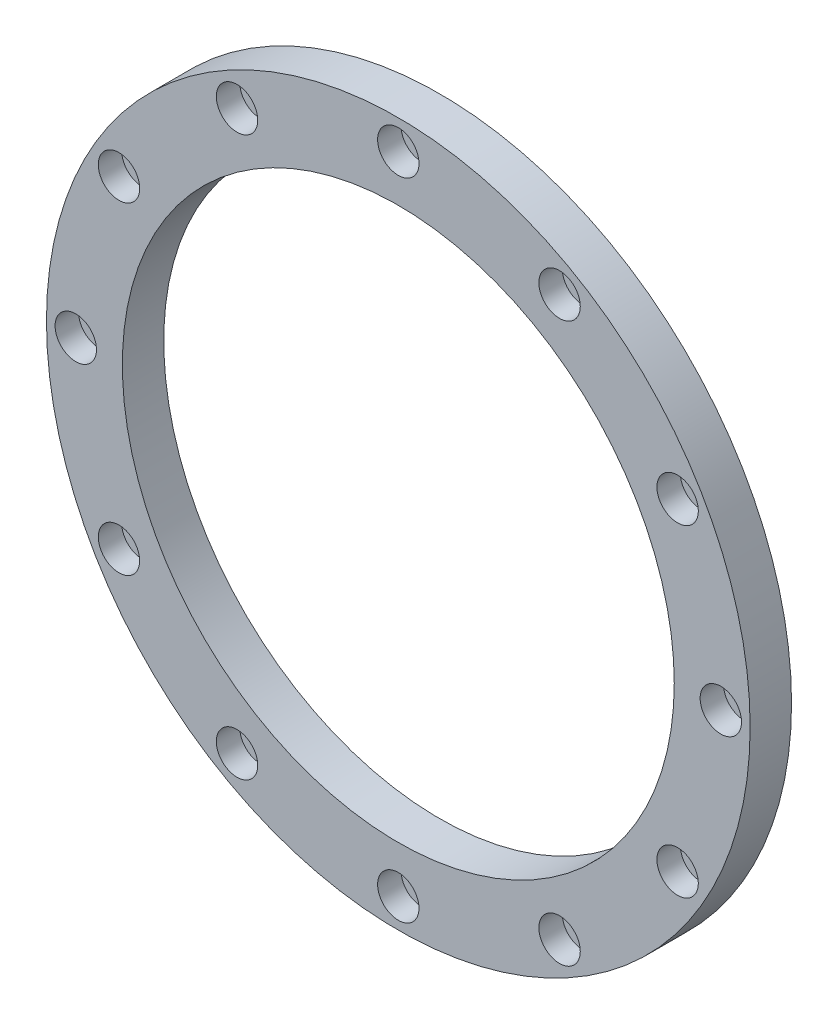
ISO-10303-21;
HEADER;
FILE_DESCRIPTION(('STEP AP214'),'2;1');
FILE_NAME('part.step','',(''),(''),'','','');
FILE_SCHEMA(('AUTOMOTIVE_DESIGN { 1 0 10303 214 1 1 1 1 }'));
ENDSEC;
DATA;
#1=APPLICATION_CONTEXT('core data for automotive mechanical design processes');
#2=APPLICATION_PROTOCOL_DEFINITION('international standard','automotive_design',2000,#1);
#3=PRODUCT_CONTEXT('',#1,'mechanical');
#4=PRODUCT('Part','Part','',(#3));
#5=PRODUCT_RELATED_PRODUCT_CATEGORY('part','',(#4));
#6=PRODUCT_DEFINITION_FORMATION('','',#4);
#7=PRODUCT_DEFINITION_CONTEXT('part definition',#1,'design');
#8=PRODUCT_DEFINITION('design','',#6,#7);
#9=PRODUCT_DEFINITION_SHAPE('','',#8);
#10=(LENGTH_UNIT() NAMED_UNIT(*) SI_UNIT(.MILLI.,.METRE.));
#11=(NAMED_UNIT(*) PLANE_ANGLE_UNIT() SI_UNIT($,.RADIAN.));
#12=(NAMED_UNIT(*) SI_UNIT($,.STERADIAN.) SOLID_ANGLE_UNIT());
#13=UNCERTAINTY_MEASURE_WITH_UNIT(LENGTH_MEASURE(1.E-05),#10,'distance_accuracy_value','');
#14=(GEOMETRIC_REPRESENTATION_CONTEXT(3) GLOBAL_UNCERTAINTY_ASSIGNED_CONTEXT((#13)) GLOBAL_UNIT_ASSIGNED_CONTEXT((#10,
#11,#12)) REPRESENTATION_CONTEXT('',''));
#15=CARTESIAN_POINT('',(0.,0.,0.));
#16=DIRECTION('',(0.,0.,1.));
#17=DIRECTION('',(1.,0.,0.));
#18=AXIS2_PLACEMENT_3D('',#15,#16,#17);
#19=CARTESIAN_POINT('',(0.,0.,6.));
#20=DIRECTION('',(0.,0.,-1.));
#21=DIRECTION('',(-1.,0.,0.));
#22=AXIS2_PLACEMENT_3D('',#19,#20,#21);
#23=CYLINDRICAL_SURFACE('',#22,51.);
#24=CARTESIAN_POINT('',(0.,0.,6.));
#25=DIRECTION('',(0.,0.,1.));
#26=DIRECTION('',(1.,0.,0.));
#27=AXIS2_PLACEMENT_3D('',#24,#25,#26);
#28=CIRCLE('',#27,51.);
#29=CARTESIAN_POINT('',(51.,0.,6.));
#30=VERTEX_POINT('',#29);
#31=EDGE_CURVE('E10',#30,#30,#28,.T.);
#32=ORIENTED_EDGE('',*,*,#31,.F.);
#33=EDGE_LOOP('',(#32));
#34=FACE_BOUND('',#33,.T.);
#35=CARTESIAN_POINT('',(0.,0.,0.));
#36=DIRECTION('',(0.,0.,1.));
#37=DIRECTION('',(1.,0.,0.));
#38=AXIS2_PLACEMENT_3D('',#35,#36,#37);
#39=CIRCLE('',#38,51.);
#40=CARTESIAN_POINT('',(51.,0.,0.));
#41=VERTEX_POINT('',#40);
#42=EDGE_CURVE('E36',#41,#41,#39,.T.);
#43=ORIENTED_EDGE('',*,*,#42,.T.);
#44=EDGE_LOOP('',(#43));
#45=FACE_BOUND('',#44,.T.);
#46=ADVANCED_FACE('F33',(#34,#45),#23,.T.);
#47=CARTESIAN_POINT('',(0.,0.,6.));
#48=DIRECTION('',(0.,0.,1.));
#49=DIRECTION('',(1.,0.,0.));
#50=AXIS2_PLACEMENT_3D('',#47,#48,#49);
#51=PLANE('',#50);
#52=CARTESIAN_POINT('',(23.3749999999995,40.4866876269228,6.));
#53=DIRECTION('',(0.,0.,1.));
#54=DIRECTION('',(1.,0.,0.));
#55=AXIS2_PLACEMENT_3D('',#52,#53,#54);
#56=CIRCLE('',#55,3.);
#57=CARTESIAN_POINT('',(26.3749999999995,40.4866876269228,6.));
#58=VERTEX_POINT('',#57);
#59=EDGE_CURVE('E191',#58,#58,#56,.T.);
#60=ORIENTED_EDGE('',*,*,#59,.F.);
#61=EDGE_LOOP('',(#60));
#62=FACE_BOUND('',#61,.T.);
#63=CARTESIAN_POINT('',(40.4866876269222,23.3750000000005,6.));
#64=DIRECTION('',(0.,0.,1.));
#65=DIRECTION('',(1.,0.,0.));
#66=AXIS2_PLACEMENT_3D('',#63,#64,#65);
#67=CIRCLE('',#66,3.);
#68=CARTESIAN_POINT('',(43.4866876269222,23.3750000000005,6.));
#69=VERTEX_POINT('',#68);
#70=EDGE_CURVE('E179',#69,#69,#67,.T.);
#71=ORIENTED_EDGE('',*,*,#70,.F.);
#72=EDGE_LOOP('',(#71));
#73=FACE_BOUND('',#72,.T.);
#74=CARTESIAN_POINT('',(46.75,4.89680257772749E-13,6.));
#75=DIRECTION('',(0.,0.,1.));
#76=DIRECTION('',(1.,0.,0.));
#77=AXIS2_PLACEMENT_3D('',#74,#75,#76);
#78=CIRCLE('',#77,3.);
#79=CARTESIAN_POINT('',(49.75,4.89680257772749E-13,6.));
#80=VERTEX_POINT('',#79);
#81=EDGE_CURVE('E167',#80,#80,#78,.T.);
#82=ORIENTED_EDGE('',*,*,#81,.F.);
#83=EDGE_LOOP('',(#82));
#84=FACE_BOUND('',#83,.T.);
#85=CARTESIAN_POINT('',(40.4866876269227,-23.3749999999996,6.));
#86=DIRECTION('',(0.,0.,1.));
#87=DIRECTION('',(1.,0.,0.));
#88=AXIS2_PLACEMENT_3D('',#85,#86,#87);
#89=CIRCLE('',#88,3.);
#90=CARTESIAN_POINT('',(43.4866876269227,-23.3749999999996,6.));
#91=VERTEX_POINT('',#90);
#92=EDGE_CURVE('E155',#91,#91,#89,.T.);
#93=ORIENTED_EDGE('',*,*,#92,.F.);
#94=EDGE_LOOP('',(#93));
#95=FACE_BOUND('',#94,.T.);
#96=CARTESIAN_POINT('',(23.3750000000003,-40.4866876269223,6.));
#97=DIRECTION('',(0.,0.,1.));
#98=DIRECTION('',(1.,0.,0.));
#99=AXIS2_PLACEMENT_3D('',#96,#97,#98);
#100=CIRCLE('',#99,3.);
#101=CARTESIAN_POINT('',(26.3750000000003,-40.4866876269223,6.));
#102=VERTEX_POINT('',#101);
#103=EDGE_CURVE('E143',#102,#102,#100,.T.);
#104=ORIENTED_EDGE('',*,*,#103,.F.);
#105=EDGE_LOOP('',(#104));
#106=FACE_BOUND('',#105,.T.);
#107=CARTESIAN_POINT('',(0.,-46.75,6.));
#108=DIRECTION('',(0.,0.,1.));
#109=DIRECTION('',(1.,0.,0.));
#110=AXIS2_PLACEMENT_3D('',#107,#108,#109);
#111=CIRCLE('',#110,3.);
#112=CARTESIAN_POINT('',(3.,-46.75,6.));
#113=VERTEX_POINT('',#112);
#114=EDGE_CURVE('E131',#113,#113,#111,.T.);
#115=ORIENTED_EDGE('',*,*,#114,.F.);
#116=EDGE_LOOP('',(#115));
#117=FACE_BOUND('',#116,.T.);
#118=CARTESIAN_POINT('',(-23.3749999999998,-40.4866876269226,6.));
#119=DIRECTION('',(0.,0.,1.));
#120=DIRECTION('',(1.,0.,0.));
#121=AXIS2_PLACEMENT_3D('',#118,#119,#120);
#122=CIRCLE('',#121,3.);
#123=CARTESIAN_POINT('',(-20.3749999999998,-40.4866876269226,6.));
#124=VERTEX_POINT('',#123);
#125=EDGE_CURVE('E119',#124,#124,#122,.T.);
#126=ORIENTED_EDGE('',*,*,#125,.F.);
#127=EDGE_LOOP('',(#126));
#128=FACE_BOUND('',#127,.T.);
#129=CARTESIAN_POINT('',(-40.4866876269224,-23.3750000000002,6.));
#130=DIRECTION('',(0.,0.,1.));
#131=DIRECTION('',(1.,0.,0.));
#132=AXIS2_PLACEMENT_3D('',#129,#130,#131);
#133=CIRCLE('',#132,3.);
#134=CARTESIAN_POINT('',(-37.4866876269224,-23.3750000000002,6.));
#135=VERTEX_POINT('',#134);
#136=EDGE_CURVE('E107',#135,#135,#133,.T.);
#137=ORIENTED_EDGE('',*,*,#136,.F.);
#138=EDGE_LOOP('',(#137));
#139=FACE_BOUND('',#138,.T.);
#140=CARTESIAN_POINT('',(-46.75,-1.63226752590916E-13,6.));
#141=DIRECTION('',(0.,0.,1.));
#142=DIRECTION('',(1.,0.,0.));
#143=AXIS2_PLACEMENT_3D('',#140,#141,#142);
#144=CIRCLE('',#143,3.);
#145=CARTESIAN_POINT('',(-43.75,-1.63226752590916E-13,6.));
#146=VERTEX_POINT('',#145);
#147=EDGE_CURVE('E95',#146,#146,#144,.T.);
#148=ORIENTED_EDGE('',*,*,#147,.F.);
#149=EDGE_LOOP('',(#148));
#150=FACE_BOUND('',#149,.T.);
#151=CARTESIAN_POINT('',(-40.4866876269226,23.3749999999999,6.));
#152=DIRECTION('',(0.,0.,1.));
#153=DIRECTION('',(1.,0.,0.));
#154=AXIS2_PLACEMENT_3D('',#151,#152,#153);
#155=CIRCLE('',#154,3.);
#156=CARTESIAN_POINT('',(-37.4866876269226,23.3749999999999,6.));
#157=VERTEX_POINT('',#156);
#158=EDGE_CURVE('E83',#157,#157,#155,.T.);
#159=ORIENTED_EDGE('',*,*,#158,.F.);
#160=EDGE_LOOP('',(#159));
#161=FACE_BOUND('',#160,.T.);
#162=CARTESIAN_POINT('',(-23.375,40.4866876269225,6.));
#163=DIRECTION('',(0.,0.,1.));
#164=DIRECTION('',(1.,0.,0.));
#165=AXIS2_PLACEMENT_3D('',#162,#163,#164);
#166=CIRCLE('',#165,3.);
#167=CARTESIAN_POINT('',(-20.375,40.4866876269225,6.));
#168=VERTEX_POINT('',#167);
#169=EDGE_CURVE('E71',#168,#168,#166,.T.);
#170=ORIENTED_EDGE('',*,*,#169,.F.);
#171=EDGE_LOOP('',(#170));
#172=FACE_BOUND('',#171,.T.);
#173=CARTESIAN_POINT('',(0.,0.,6.));
#174=DIRECTION('',(0.,0.,1.));
#175=DIRECTION('',(1.,0.,0.));
#176=AXIS2_PLACEMENT_3D('',#173,#174,#175);
#177=CIRCLE('',#176,40.);
#178=CARTESIAN_POINT('',(40.,0.,6.));
#179=VERTEX_POINT('',#178);
#180=EDGE_CURVE('E57',#179,#179,#177,.T.);
#181=ORIENTED_EDGE('',*,*,#180,.F.);
#182=EDGE_LOOP('',(#181));
#183=FACE_BOUND('',#182,.T.);
#184=CARTESIAN_POINT('',(0.,46.75,6.));
#185=DIRECTION('',(0.,0.,1.));
#186=DIRECTION('',(1.,0.,0.));
#187=AXIS2_PLACEMENT_3D('',#184,#185,#186);
#188=CIRCLE('',#187,3.);
#189=CARTESIAN_POINT('',(3.,46.75,6.));
#190=VERTEX_POINT('',#189);
#191=EDGE_CURVE('E53',#190,#190,#188,.T.);
#192=ORIENTED_EDGE('',*,*,#191,.F.);
#193=EDGE_LOOP('',(#192));
#194=FACE_BOUND('',#193,.T.);
#195=ORIENTED_EDGE('',*,*,#31,.T.);
#196=EDGE_LOOP('',(#195));
#197=FACE_BOUND('',#196,.T.);
#198=ADVANCED_FACE('F197',(#62,#73,#84,#95,#106,#117,#128,#139,#150,#161,#172,#183,#194,#197),
#51,.T.);
#199=CARTESIAN_POINT('',(0.,0.,0.));
#200=DIRECTION('',(0.,0.,1.));
#201=DIRECTION('',(1.,0.,0.));
#202=AXIS2_PLACEMENT_3D('',#199,#200,#201);
#203=PLANE('',#202);
#204=CARTESIAN_POINT('',(23.3749999999995,40.4866876269228,0.));
#205=DIRECTION('',(0.,0.,1.));
#206=DIRECTION('',(1.,0.,0.));
#207=AXIS2_PLACEMENT_3D('',#204,#205,#206);
#208=CIRCLE('',#207,1.7);
#209=CARTESIAN_POINT('',(25.0749999999995,40.4866876269228,0.));
#210=VERTEX_POINT('',#209);
#211=EDGE_CURVE('E182',#210,#210,#208,.T.);
#212=ORIENTED_EDGE('',*,*,#211,.T.);
#213=EDGE_LOOP('',(#212));
#214=FACE_BOUND('',#213,.T.);
#215=CARTESIAN_POINT('',(40.4866876269222,23.3750000000005,0.));
#216=DIRECTION('',(0.,0.,1.));
#217=DIRECTION('',(1.,0.,0.));
#218=AXIS2_PLACEMENT_3D('',#215,#216,#217);
#219=CIRCLE('',#218,1.7);
#220=CARTESIAN_POINT('',(42.1866876269222,23.3750000000005,0.));
#221=VERTEX_POINT('',#220);
#222=EDGE_CURVE('E170',#221,#221,#219,.T.);
#223=ORIENTED_EDGE('',*,*,#222,.T.);
#224=EDGE_LOOP('',(#223));
#225=FACE_BOUND('',#224,.T.);
#226=CARTESIAN_POINT('',(46.75,4.89680257772749E-13,0.));
#227=DIRECTION('',(0.,0.,1.));
#228=DIRECTION('',(1.,0.,0.));
#229=AXIS2_PLACEMENT_3D('',#226,#227,#228);
#230=CIRCLE('',#229,1.7);
#231=CARTESIAN_POINT('',(48.45,4.89680257772749E-13,0.));
#232=VERTEX_POINT('',#231);
#233=EDGE_CURVE('E158',#232,#232,#230,.T.);
#234=ORIENTED_EDGE('',*,*,#233,.T.);
#235=EDGE_LOOP('',(#234));
#236=FACE_BOUND('',#235,.T.);
#237=CARTESIAN_POINT('',(40.4866876269227,-23.3749999999996,0.));
#238=DIRECTION('',(0.,0.,1.));
#239=DIRECTION('',(1.,0.,0.));
#240=AXIS2_PLACEMENT_3D('',#237,#238,#239);
#241=CIRCLE('',#240,1.7);
#242=CARTESIAN_POINT('',(42.1866876269227,-23.3749999999996,0.));
#243=VERTEX_POINT('',#242);
#244=EDGE_CURVE('E146',#243,#243,#241,.T.);
#245=ORIENTED_EDGE('',*,*,#244,.T.);
#246=EDGE_LOOP('',(#245));
#247=FACE_BOUND('',#246,.T.);
#248=CARTESIAN_POINT('',(23.3750000000003,-40.4866876269223,0.));
#249=DIRECTION('',(0.,0.,1.));
#250=DIRECTION('',(1.,0.,0.));
#251=AXIS2_PLACEMENT_3D('',#248,#249,#250);
#252=CIRCLE('',#251,1.7);
#253=CARTESIAN_POINT('',(25.0750000000003,-40.4866876269223,0.));
#254=VERTEX_POINT('',#253);
#255=EDGE_CURVE('E134',#254,#254,#252,.T.);
#256=ORIENTED_EDGE('',*,*,#255,.T.);
#257=EDGE_LOOP('',(#256));
#258=FACE_BOUND('',#257,.T.);
#259=CARTESIAN_POINT('',(0.,-46.75,0.));
#260=DIRECTION('',(0.,0.,1.));
#261=DIRECTION('',(1.,0.,0.));
#262=AXIS2_PLACEMENT_3D('',#259,#260,#261);
#263=CIRCLE('',#262,1.7);
#264=CARTESIAN_POINT('',(1.7,-46.75,0.));
#265=VERTEX_POINT('',#264);
#266=EDGE_CURVE('E122',#265,#265,#263,.T.);
#267=ORIENTED_EDGE('',*,*,#266,.T.);
#268=EDGE_LOOP('',(#267));
#269=FACE_BOUND('',#268,.T.);
#270=CARTESIAN_POINT('',(-23.3749999999998,-40.4866876269226,0.));
#271=DIRECTION('',(0.,0.,1.));
#272=DIRECTION('',(1.,0.,0.));
#273=AXIS2_PLACEMENT_3D('',#270,#271,#272);
#274=CIRCLE('',#273,1.7);
#275=CARTESIAN_POINT('',(-21.6749999999998,-40.4866876269226,0.));
#276=VERTEX_POINT('',#275);
#277=EDGE_CURVE('E110',#276,#276,#274,.T.);
#278=ORIENTED_EDGE('',*,*,#277,.T.);
#279=EDGE_LOOP('',(#278));
#280=FACE_BOUND('',#279,.T.);
#281=CARTESIAN_POINT('',(-40.4866876269224,-23.3750000000002,0.));
#282=DIRECTION('',(0.,0.,1.));
#283=DIRECTION('',(1.,0.,0.));
#284=AXIS2_PLACEMENT_3D('',#281,#282,#283);
#285=CIRCLE('',#284,1.7);
#286=CARTESIAN_POINT('',(-38.7866876269224,-23.3750000000002,0.));
#287=VERTEX_POINT('',#286);
#288=EDGE_CURVE('E98',#287,#287,#285,.T.);
#289=ORIENTED_EDGE('',*,*,#288,.T.);
#290=EDGE_LOOP('',(#289));
#291=FACE_BOUND('',#290,.T.);
#292=CARTESIAN_POINT('',(-46.75,-1.63226752590916E-13,0.));
#293=DIRECTION('',(0.,0.,1.));
#294=DIRECTION('',(1.,0.,0.));
#295=AXIS2_PLACEMENT_3D('',#292,#293,#294);
#296=CIRCLE('',#295,1.7);
#297=CARTESIAN_POINT('',(-45.05,-1.63226752590916E-13,0.));
#298=VERTEX_POINT('',#297);
#299=EDGE_CURVE('E86',#298,#298,#296,.T.);
#300=ORIENTED_EDGE('',*,*,#299,.T.);
#301=EDGE_LOOP('',(#300));
#302=FACE_BOUND('',#301,.T.);
#303=CARTESIAN_POINT('',(-40.4866876269226,23.3749999999999,0.));
#304=DIRECTION('',(0.,0.,1.));
#305=DIRECTION('',(1.,0.,0.));
#306=AXIS2_PLACEMENT_3D('',#303,#304,#305);
#307=CIRCLE('',#306,1.7);
#308=CARTESIAN_POINT('',(-38.7866876269226,23.3749999999999,0.));
#309=VERTEX_POINT('',#308);
#310=EDGE_CURVE('E74',#309,#309,#307,.T.);
#311=ORIENTED_EDGE('',*,*,#310,.T.);
#312=EDGE_LOOP('',(#311));
#313=FACE_BOUND('',#312,.T.);
#314=CARTESIAN_POINT('',(-23.375,40.4866876269225,0.));
#315=DIRECTION('',(0.,0.,1.));
#316=DIRECTION('',(1.,0.,0.));
#317=AXIS2_PLACEMENT_3D('',#314,#315,#316);
#318=CIRCLE('',#317,1.7);
#319=CARTESIAN_POINT('',(-21.675,40.4866876269225,0.));
#320=VERTEX_POINT('',#319);
#321=EDGE_CURVE('E60',#320,#320,#318,.T.);
#322=ORIENTED_EDGE('',*,*,#321,.T.);
#323=EDGE_LOOP('',(#322));
#324=FACE_BOUND('',#323,.T.);
#325=CARTESIAN_POINT('',(0.,0.,0.));
#326=DIRECTION('',(0.,0.,1.));
#327=DIRECTION('',(1.,0.,0.));
#328=AXIS2_PLACEMENT_3D('',#325,#326,#327);
#329=CIRCLE('',#328,40.);
#330=CARTESIAN_POINT('',(40.,0.,0.));
#331=VERTEX_POINT('',#330);
#332=EDGE_CURVE('E56',#331,#331,#329,.T.);
#333=ORIENTED_EDGE('',*,*,#332,.T.);
#334=EDGE_LOOP('',(#333));
#335=FACE_BOUND('',#334,.T.);
#336=CARTESIAN_POINT('',(0.,46.75,0.));
#337=DIRECTION('',(0.,0.,1.));
#338=DIRECTION('',(1.,0.,0.));
#339=AXIS2_PLACEMENT_3D('',#336,#337,#338);
#340=CIRCLE('',#339,1.7);
#341=CARTESIAN_POINT('',(1.7,46.75,0.));
#342=VERTEX_POINT('',#341);
#343=EDGE_CURVE('E43',#342,#342,#340,.T.);
#344=ORIENTED_EDGE('',*,*,#343,.T.);
#345=EDGE_LOOP('',(#344));
#346=FACE_BOUND('',#345,.T.);
#347=ORIENTED_EDGE('',*,*,#42,.F.);
#348=EDGE_LOOP('',(#347));
#349=FACE_BOUND('',#348,.T.);
#350=ADVANCED_FACE('F200',(#214,#225,#236,#247,#258,#269,#280,#291,#302,#313,#324,#335,#346,
#349),#203,.F.);
#351=CARTESIAN_POINT('',(0.,46.75,6.));
#352=DIRECTION('',(0.,0.,1.));
#353=DIRECTION('',(1.,0.,0.));
#354=AXIS2_PLACEMENT_3D('',#351,#352,#353);
#355=CYLINDRICAL_SURFACE('',#354,1.7);
#356=ORIENTED_EDGE('',*,*,#343,.F.);
#357=EDGE_LOOP('',(#356));
#358=FACE_BOUND('',#357,.T.);
#359=CARTESIAN_POINT('',(0.,46.75,2.6));
#360=DIRECTION('',(0.,0.,1.));
#361=DIRECTION('',(1.,0.,0.));
#362=AXIS2_PLACEMENT_3D('',#359,#360,#361);
#363=CIRCLE('',#362,1.7);
#364=CARTESIAN_POINT('',(1.7,46.75,2.6));
#365=VERTEX_POINT('',#364);
#366=EDGE_CURVE('E47',#365,#365,#363,.T.);
#367=ORIENTED_EDGE('',*,*,#366,.T.);
#368=EDGE_LOOP('',(#367));
#369=FACE_BOUND('',#368,.T.);
#370=ADVANCED_FACE('F239',(#358,#369),#355,.F.);
#371=CARTESIAN_POINT('',(1.7,46.75,2.6));
#372=DIRECTION('',(0.,0.,-1.));
#373=DIRECTION('',(-1.,0.,0.));
#374=AXIS2_PLACEMENT_3D('',#371,#372,#373);
#375=PLANE('',#374);
#376=ORIENTED_EDGE('',*,*,#366,.F.);
#377=EDGE_LOOP('',(#376));
#378=FACE_BOUND('',#377,.T.);
#379=CARTESIAN_POINT('',(0.,46.75,2.6));
#380=DIRECTION('',(0.,0.,1.));
#381=DIRECTION('',(1.,0.,0.));
#382=AXIS2_PLACEMENT_3D('',#379,#380,#381);
#383=CIRCLE('',#382,3.);
#384=CARTESIAN_POINT('',(3.,46.75,2.6));
#385=VERTEX_POINT('',#384);
#386=EDGE_CURVE('E50',#385,#385,#383,.T.);
#387=ORIENTED_EDGE('',*,*,#386,.T.);
#388=EDGE_LOOP('',(#387));
#389=FACE_BOUND('',#388,.T.);
#390=ADVANCED_FACE('F229',(#378,#389),#375,.F.);
#391=CARTESIAN_POINT('',(0.,46.75,6.));
#392=DIRECTION('',(0.,0.,1.));
#393=DIRECTION('',(1.,0.,0.));
#394=AXIS2_PLACEMENT_3D('',#391,#392,#393);
#395=CYLINDRICAL_SURFACE('',#394,3.);
#396=ORIENTED_EDGE('',*,*,#386,.F.);
#397=EDGE_LOOP('',(#396));
#398=FACE_BOUND('',#397,.T.);
#399=ORIENTED_EDGE('',*,*,#191,.T.);
#400=EDGE_LOOP('',(#399));
#401=FACE_BOUND('',#400,.T.);
#402=ADVANCED_FACE('F226',(#398,#401),#395,.F.);
#403=CARTESIAN_POINT('',(0.,0.,0.));
#404=DIRECTION('',(0.,0.,1.));
#405=DIRECTION('',(1.,0.,0.));
#406=AXIS2_PLACEMENT_3D('',#403,#404,#405);
#407=CYLINDRICAL_SURFACE('',#406,40.);
#408=ORIENTED_EDGE('',*,*,#332,.F.);
#409=EDGE_LOOP('',(#408));
#410=FACE_BOUND('',#409,.T.);
#411=ORIENTED_EDGE('',*,*,#180,.T.);
#412=EDGE_LOOP('',(#411));
#413=FACE_BOUND('',#412,.T.);
#414=ADVANCED_FACE('F228',(#410,#413),#407,.F.);
#415=CARTESIAN_POINT('',(-23.375,40.4866876269225,6.));
#416=DIRECTION('',(0.,0.,1.));
#417=DIRECTION('',(1.,0.,0.));
#418=AXIS2_PLACEMENT_3D('',#415,#416,#417);
#419=CYLINDRICAL_SURFACE('',#418,1.7);
#420=ORIENTED_EDGE('',*,*,#321,.F.);
#421=EDGE_LOOP('',(#420));
#422=FACE_BOUND('',#421,.T.);
#423=CARTESIAN_POINT('',(-23.375,40.4866876269225,2.6));
#424=DIRECTION('',(0.,0.,1.));
#425=DIRECTION('',(1.,0.,0.));
#426=AXIS2_PLACEMENT_3D('',#423,#424,#425);
#427=CIRCLE('',#426,1.7);
#428=CARTESIAN_POINT('',(-21.675,40.4866876269225,2.6));
#429=VERTEX_POINT('',#428);
#430=EDGE_CURVE('E65',#429,#429,#427,.T.);
#431=ORIENTED_EDGE('',*,*,#430,.T.);
#432=EDGE_LOOP('',(#431));
#433=FACE_BOUND('',#432,.T.);
#434=ADVANCED_FACE('F236',(#422,#433),#419,.F.);
#435=CARTESIAN_POINT('',(-21.675,40.4866876269225,2.6));
#436=DIRECTION('',(0.,0.,-1.));
#437=DIRECTION('',(-1.,0.,0.));
#438=AXIS2_PLACEMENT_3D('',#435,#436,#437);
#439=PLANE('',#438);
#440=ORIENTED_EDGE('',*,*,#430,.F.);
#441=EDGE_LOOP('',(#440));
#442=FACE_BOUND('',#441,.T.);
#443=CARTESIAN_POINT('',(-23.375,40.4866876269225,2.6));
#444=DIRECTION('',(0.,0.,1.));
#445=DIRECTION('',(1.,0.,0.));
#446=AXIS2_PLACEMENT_3D('',#443,#444,#445);
#447=CIRCLE('',#446,3.);
#448=CARTESIAN_POINT('',(-20.375,40.4866876269225,2.6));
#449=VERTEX_POINT('',#448);
#450=EDGE_CURVE('E68',#449,#449,#447,.T.);
#451=ORIENTED_EDGE('',*,*,#450,.T.);
#452=EDGE_LOOP('',(#451));
#453=FACE_BOUND('',#452,.T.);
#454=ADVANCED_FACE('F289',(#442,#453),#439,.F.);
#455=CARTESIAN_POINT('',(-23.375,40.4866876269225,6.));
#456=DIRECTION('',(0.,0.,1.));
#457=DIRECTION('',(1.,0.,0.));
#458=AXIS2_PLACEMENT_3D('',#455,#456,#457);
#459=CYLINDRICAL_SURFACE('',#458,3.);
#460=ORIENTED_EDGE('',*,*,#450,.F.);
#461=EDGE_LOOP('',(#460));
#462=FACE_BOUND('',#461,.T.);
#463=ORIENTED_EDGE('',*,*,#169,.T.);
#464=EDGE_LOOP('',(#463));
#465=FACE_BOUND('',#464,.T.);
#466=ADVANCED_FACE('F295',(#462,#465),#459,.F.);
#467=CARTESIAN_POINT('',(-40.4866876269226,23.3749999999999,6.));
#468=DIRECTION('',(0.,0.,1.));
#469=DIRECTION('',(1.,0.,0.));
#470=AXIS2_PLACEMENT_3D('',#467,#468,#469);
#471=CYLINDRICAL_SURFACE('',#470,1.7);
#472=ORIENTED_EDGE('',*,*,#310,.F.);
#473=EDGE_LOOP('',(#472));
#474=FACE_BOUND('',#473,.T.);
#475=CARTESIAN_POINT('',(-40.4866876269226,23.3749999999999,2.6));
#476=DIRECTION('',(0.,0.,1.));
#477=DIRECTION('',(1.,0.,0.));
#478=AXIS2_PLACEMENT_3D('',#475,#476,#477);
#479=CIRCLE('',#478,1.7);
#480=CARTESIAN_POINT('',(-38.7866876269226,23.3749999999999,2.6));
#481=VERTEX_POINT('',#480);
#482=EDGE_CURVE('E77',#481,#481,#479,.T.);
#483=ORIENTED_EDGE('',*,*,#482,.T.);
#484=EDGE_LOOP('',(#483));
#485=FACE_BOUND('',#484,.T.);
#486=ADVANCED_FACE('F301',(#474,#485),#471,.F.);
#487=CARTESIAN_POINT('',(-38.7866876269226,23.3749999999999,2.6));
#488=DIRECTION('',(0.,0.,-1.));
#489=DIRECTION('',(-1.,0.,0.));
#490=AXIS2_PLACEMENT_3D('',#487,#488,#489);
#491=PLANE('',#490);
#492=ORIENTED_EDGE('',*,*,#482,.F.);
#493=EDGE_LOOP('',(#492));
#494=FACE_BOUND('',#493,.T.);
#495=CARTESIAN_POINT('',(-40.4866876269226,23.3749999999999,2.6));
#496=DIRECTION('',(0.,0.,1.));
#497=DIRECTION('',(1.,0.,0.));
#498=AXIS2_PLACEMENT_3D('',#495,#496,#497);
#499=CIRCLE('',#498,3.);
#500=CARTESIAN_POINT('',(-37.4866876269226,23.3749999999999,2.6));
#501=VERTEX_POINT('',#500);
#502=EDGE_CURVE('E80',#501,#501,#499,.T.);
#503=ORIENTED_EDGE('',*,*,#502,.T.);
#504=EDGE_LOOP('',(#503));
#505=FACE_BOUND('',#504,.T.);
#506=ADVANCED_FACE('F306',(#494,#505),#491,.F.);
#507=CARTESIAN_POINT('',(-40.4866876269226,23.3749999999999,6.));
#508=DIRECTION('',(0.,0.,1.));
#509=DIRECTION('',(1.,0.,0.));
#510=AXIS2_PLACEMENT_3D('',#507,#508,#509);
#511=CYLINDRICAL_SURFACE('',#510,3.);
#512=ORIENTED_EDGE('',*,*,#502,.F.);
#513=EDGE_LOOP('',(#512));
#514=FACE_BOUND('',#513,.T.);
#515=ORIENTED_EDGE('',*,*,#158,.T.);
#516=EDGE_LOOP('',(#515));
#517=FACE_BOUND('',#516,.T.);
#518=ADVANCED_FACE('F312',(#514,#517),#511,.F.);
#519=CARTESIAN_POINT('',(-46.75,-1.63226752590916E-13,6.));
#520=DIRECTION('',(0.,0.,1.));
#521=DIRECTION('',(1.,0.,0.));
#522=AXIS2_PLACEMENT_3D('',#519,#520,#521);
#523=CYLINDRICAL_SURFACE('',#522,1.7);
#524=ORIENTED_EDGE('',*,*,#299,.F.);
#525=EDGE_LOOP('',(#524));
#526=FACE_BOUND('',#525,.T.);
#527=CARTESIAN_POINT('',(-46.75,-1.63226752590916E-13,2.6));
#528=DIRECTION('',(0.,0.,1.));
#529=DIRECTION('',(1.,0.,0.));
#530=AXIS2_PLACEMENT_3D('',#527,#528,#529);
#531=CIRCLE('',#530,1.7);
#532=CARTESIAN_POINT('',(-45.05,-1.63226752590916E-13,2.6));
#533=VERTEX_POINT('',#532);
#534=EDGE_CURVE('E89',#533,#533,#531,.T.);
#535=ORIENTED_EDGE('',*,*,#534,.T.);
#536=EDGE_LOOP('',(#535));
#537=FACE_BOUND('',#536,.T.);
#538=ADVANCED_FACE('F316',(#526,#537),#523,.F.);
#539=CARTESIAN_POINT('',(-45.05,-1.63226752590916E-13,2.6));
#540=DIRECTION('',(0.,0.,-1.));
#541=DIRECTION('',(-1.,0.,0.));
#542=AXIS2_PLACEMENT_3D('',#539,#540,#541);
#543=PLANE('',#542);
#544=ORIENTED_EDGE('',*,*,#534,.F.);
#545=EDGE_LOOP('',(#544));
#546=FACE_BOUND('',#545,.T.);
#547=CARTESIAN_POINT('',(-46.75,-1.63226752590916E-13,2.6));
#548=DIRECTION('',(0.,0.,1.));
#549=DIRECTION('',(1.,0.,0.));
#550=AXIS2_PLACEMENT_3D('',#547,#548,#549);
#551=CIRCLE('',#550,3.);
#552=CARTESIAN_POINT('',(-43.75,-1.63226752590916E-13,2.6));
#553=VERTEX_POINT('',#552);
#554=EDGE_CURVE('E92',#553,#553,#551,.T.);
#555=ORIENTED_EDGE('',*,*,#554,.T.);
#556=EDGE_LOOP('',(#555));
#557=FACE_BOUND('',#556,.T.);
#558=ADVANCED_FACE('F320',(#546,#557),#543,.F.);
#559=CARTESIAN_POINT('',(-46.75,-1.63226752590916E-13,6.));
#560=DIRECTION('',(0.,0.,1.));
#561=DIRECTION('',(1.,0.,0.));
#562=AXIS2_PLACEMENT_3D('',#559,#560,#561);
#563=CYLINDRICAL_SURFACE('',#562,3.);
#564=ORIENTED_EDGE('',*,*,#554,.F.);
#565=EDGE_LOOP('',(#564));
#566=FACE_BOUND('',#565,.T.);
#567=ORIENTED_EDGE('',*,*,#147,.T.);
#568=EDGE_LOOP('',(#567));
#569=FACE_BOUND('',#568,.T.);
#570=ADVANCED_FACE('F324',(#566,#569),#563,.F.);
#571=CARTESIAN_POINT('',(-40.4866876269224,-23.3750000000002,6.));
#572=DIRECTION('',(0.,0.,1.));
#573=DIRECTION('',(1.,0.,0.));
#574=AXIS2_PLACEMENT_3D('',#571,#572,#573);
#575=CYLINDRICAL_SURFACE('',#574,1.7);
#576=ORIENTED_EDGE('',*,*,#288,.F.);
#577=EDGE_LOOP('',(#576));
#578=FACE_BOUND('',#577,.T.);
#579=CARTESIAN_POINT('',(-40.4866876269224,-23.3750000000002,2.6));
#580=DIRECTION('',(0.,0.,1.));
#581=DIRECTION('',(1.,0.,0.));
#582=AXIS2_PLACEMENT_3D('',#579,#580,#581);
#583=CIRCLE('',#582,1.7);
#584=CARTESIAN_POINT('',(-38.7866876269224,-23.3750000000002,2.6));
#585=VERTEX_POINT('',#584);
#586=EDGE_CURVE('E101',#585,#585,#583,.T.);
#587=ORIENTED_EDGE('',*,*,#586,.T.);
#588=EDGE_LOOP('',(#587));
#589=FACE_BOUND('',#588,.T.);
#590=ADVANCED_FACE('F328',(#578,#589),#575,.F.);
#591=CARTESIAN_POINT('',(-38.7866876269224,-23.3750000000002,2.6));
#592=DIRECTION('',(0.,0.,-1.));
#593=DIRECTION('',(-1.,0.,0.));
#594=AXIS2_PLACEMENT_3D('',#591,#592,#593);
#595=PLANE('',#594);
#596=ORIENTED_EDGE('',*,*,#586,.F.);
#597=EDGE_LOOP('',(#596));
#598=FACE_BOUND('',#597,.T.);
#599=CARTESIAN_POINT('',(-40.4866876269224,-23.3750000000002,2.6));
#600=DIRECTION('',(0.,0.,1.));
#601=DIRECTION('',(1.,0.,0.));
#602=AXIS2_PLACEMENT_3D('',#599,#600,#601);
#603=CIRCLE('',#602,3.);
#604=CARTESIAN_POINT('',(-37.4866876269224,-23.3750000000002,2.6));
#605=VERTEX_POINT('',#604);
#606=EDGE_CURVE('E104',#605,#605,#603,.T.);
#607=ORIENTED_EDGE('',*,*,#606,.T.);
#608=EDGE_LOOP('',(#607));
#609=FACE_BOUND('',#608,.T.);
#610=ADVANCED_FACE('F332',(#598,#609),#595,.F.);
#611=CARTESIAN_POINT('',(-40.4866876269224,-23.3750000000002,6.));
#612=DIRECTION('',(0.,0.,1.));
#613=DIRECTION('',(1.,0.,0.));
#614=AXIS2_PLACEMENT_3D('',#611,#612,#613);
#615=CYLINDRICAL_SURFACE('',#614,3.);
#616=ORIENTED_EDGE('',*,*,#606,.F.);
#617=EDGE_LOOP('',(#616));
#618=FACE_BOUND('',#617,.T.);
#619=ORIENTED_EDGE('',*,*,#136,.T.);
#620=EDGE_LOOP('',(#619));
#621=FACE_BOUND('',#620,.T.);
#622=ADVANCED_FACE('F336',(#618,#621),#615,.F.);
#623=CARTESIAN_POINT('',(-23.3749999999998,-40.4866876269226,6.));
#624=DIRECTION('',(0.,0.,1.));
#625=DIRECTION('',(1.,0.,0.));
#626=AXIS2_PLACEMENT_3D('',#623,#624,#625);
#627=CYLINDRICAL_SURFACE('',#626,1.7);
#628=ORIENTED_EDGE('',*,*,#277,.F.);
#629=EDGE_LOOP('',(#628));
#630=FACE_BOUND('',#629,.T.);
#631=CARTESIAN_POINT('',(-23.3749999999998,-40.4866876269226,2.6));
#632=DIRECTION('',(0.,0.,1.));
#633=DIRECTION('',(1.,0.,0.));
#634=AXIS2_PLACEMENT_3D('',#631,#632,#633);
#635=CIRCLE('',#634,1.7);
#636=CARTESIAN_POINT('',(-21.6749999999998,-40.4866876269226,2.6));
#637=VERTEX_POINT('',#636);
#638=EDGE_CURVE('E113',#637,#637,#635,.T.);
#639=ORIENTED_EDGE('',*,*,#638,.T.);
#640=EDGE_LOOP('',(#639));
#641=FACE_BOUND('',#640,.T.);
#642=ADVANCED_FACE('F340',(#630,#641),#627,.F.);
#643=CARTESIAN_POINT('',(-21.6749999999998,-40.4866876269226,2.6));
#644=DIRECTION('',(0.,0.,-1.));
#645=DIRECTION('',(-1.,0.,0.));
#646=AXIS2_PLACEMENT_3D('',#643,#644,#645);
#647=PLANE('',#646);
#648=ORIENTED_EDGE('',*,*,#638,.F.);
#649=EDGE_LOOP('',(#648));
#650=FACE_BOUND('',#649,.T.);
#651=CARTESIAN_POINT('',(-23.3749999999998,-40.4866876269226,2.6));
#652=DIRECTION('',(0.,0.,1.));
#653=DIRECTION('',(1.,0.,0.));
#654=AXIS2_PLACEMENT_3D('',#651,#652,#653);
#655=CIRCLE('',#654,3.);
#656=CARTESIAN_POINT('',(-20.3749999999998,-40.4866876269226,2.6));
#657=VERTEX_POINT('',#656);
#658=EDGE_CURVE('E116',#657,#657,#655,.T.);
#659=ORIENTED_EDGE('',*,*,#658,.T.);
#660=EDGE_LOOP('',(#659));
#661=FACE_BOUND('',#660,.T.);
#662=ADVANCED_FACE('F344',(#650,#661),#647,.F.);
#663=CARTESIAN_POINT('',(-23.3749999999998,-40.4866876269226,6.));
#664=DIRECTION('',(0.,0.,1.));
#665=DIRECTION('',(1.,0.,0.));
#666=AXIS2_PLACEMENT_3D('',#663,#664,#665);
#667=CYLINDRICAL_SURFACE('',#666,3.);
#668=ORIENTED_EDGE('',*,*,#658,.F.);
#669=EDGE_LOOP('',(#668));
#670=FACE_BOUND('',#669,.T.);
#671=ORIENTED_EDGE('',*,*,#125,.T.);
#672=EDGE_LOOP('',(#671));
#673=FACE_BOUND('',#672,.T.);
#674=ADVANCED_FACE('F348',(#670,#673),#667,.F.);
#675=CARTESIAN_POINT('',(0.,-46.75,6.));
#676=DIRECTION('',(0.,0.,1.));
#677=DIRECTION('',(1.,0.,0.));
#678=AXIS2_PLACEMENT_3D('',#675,#676,#677);
#679=CYLINDRICAL_SURFACE('',#678,1.7);
#680=ORIENTED_EDGE('',*,*,#266,.F.);
#681=EDGE_LOOP('',(#680));
#682=FACE_BOUND('',#681,.T.);
#683=CARTESIAN_POINT('',(0.,-46.75,2.6));
#684=DIRECTION('',(0.,0.,1.));
#685=DIRECTION('',(1.,0.,0.));
#686=AXIS2_PLACEMENT_3D('',#683,#684,#685);
#687=CIRCLE('',#686,1.7);
#688=CARTESIAN_POINT('',(1.7,-46.75,2.6));
#689=VERTEX_POINT('',#688);
#690=EDGE_CURVE('E125',#689,#689,#687,.T.);
#691=ORIENTED_EDGE('',*,*,#690,.T.);
#692=EDGE_LOOP('',(#691));
#693=FACE_BOUND('',#692,.T.);
#694=ADVANCED_FACE('F352',(#682,#693),#679,.F.);
#695=CARTESIAN_POINT('',(1.7,-46.75,2.6));
#696=DIRECTION('',(0.,0.,-1.));
#697=DIRECTION('',(-1.,0.,0.));
#698=AXIS2_PLACEMENT_3D('',#695,#696,#697);
#699=PLANE('',#698);
#700=ORIENTED_EDGE('',*,*,#690,.F.);
#701=EDGE_LOOP('',(#700));
#702=FACE_BOUND('',#701,.T.);
#703=CARTESIAN_POINT('',(0.,-46.75,2.6));
#704=DIRECTION('',(0.,0.,1.));
#705=DIRECTION('',(1.,0.,0.));
#706=AXIS2_PLACEMENT_3D('',#703,#704,#705);
#707=CIRCLE('',#706,3.);
#708=CARTESIAN_POINT('',(3.,-46.75,2.6));
#709=VERTEX_POINT('',#708);
#710=EDGE_CURVE('E128',#709,#709,#707,.T.);
#711=ORIENTED_EDGE('',*,*,#710,.T.);
#712=EDGE_LOOP('',(#711));
#713=FACE_BOUND('',#712,.T.);
#714=ADVANCED_FACE('F356',(#702,#713),#699,.F.);
#715=CARTESIAN_POINT('',(0.,-46.75,6.));
#716=DIRECTION('',(0.,0.,1.));
#717=DIRECTION('',(1.,0.,0.));
#718=AXIS2_PLACEMENT_3D('',#715,#716,#717);
#719=CYLINDRICAL_SURFACE('',#718,3.);
#720=ORIENTED_EDGE('',*,*,#710,.F.);
#721=EDGE_LOOP('',(#720));
#722=FACE_BOUND('',#721,.T.);
#723=ORIENTED_EDGE('',*,*,#114,.T.);
#724=EDGE_LOOP('',(#723));
#725=FACE_BOUND('',#724,.T.);
#726=ADVANCED_FACE('F360',(#722,#725),#719,.F.);
#727=CARTESIAN_POINT('',(23.3750000000003,-40.4866876269223,6.));
#728=DIRECTION('',(0.,0.,1.));
#729=DIRECTION('',(1.,0.,0.));
#730=AXIS2_PLACEMENT_3D('',#727,#728,#729);
#731=CYLINDRICAL_SURFACE('',#730,1.7);
#732=ORIENTED_EDGE('',*,*,#255,.F.);
#733=EDGE_LOOP('',(#732));
#734=FACE_BOUND('',#733,.T.);
#735=CARTESIAN_POINT('',(23.3750000000003,-40.4866876269223,2.6));
#736=DIRECTION('',(0.,0.,1.));
#737=DIRECTION('',(1.,0.,0.));
#738=AXIS2_PLACEMENT_3D('',#735,#736,#737);
#739=CIRCLE('',#738,1.7);
#740=CARTESIAN_POINT('',(25.0750000000003,-40.4866876269223,2.6));
#741=VERTEX_POINT('',#740);
#742=EDGE_CURVE('E137',#741,#741,#739,.T.);
#743=ORIENTED_EDGE('',*,*,#742,.T.);
#744=EDGE_LOOP('',(#743));
#745=FACE_BOUND('',#744,.T.);
#746=ADVANCED_FACE('F364',(#734,#745),#731,.F.);
#747=CARTESIAN_POINT('',(25.0750000000003,-40.4866876269223,2.6));
#748=DIRECTION('',(0.,0.,-1.));
#749=DIRECTION('',(-1.,0.,0.));
#750=AXIS2_PLACEMENT_3D('',#747,#748,#749);
#751=PLANE('',#750);
#752=ORIENTED_EDGE('',*,*,#742,.F.);
#753=EDGE_LOOP('',(#752));
#754=FACE_BOUND('',#753,.T.);
#755=CARTESIAN_POINT('',(23.3750000000003,-40.4866876269223,2.6));
#756=DIRECTION('',(0.,0.,1.));
#757=DIRECTION('',(1.,0.,0.));
#758=AXIS2_PLACEMENT_3D('',#755,#756,#757);
#759=CIRCLE('',#758,3.);
#760=CARTESIAN_POINT('',(26.3750000000003,-40.4866876269223,2.6));
#761=VERTEX_POINT('',#760);
#762=EDGE_CURVE('E140',#761,#761,#759,.T.);
#763=ORIENTED_EDGE('',*,*,#762,.T.);
#764=EDGE_LOOP('',(#763));
#765=FACE_BOUND('',#764,.T.);
#766=ADVANCED_FACE('F368',(#754,#765),#751,.F.);
#767=CARTESIAN_POINT('',(23.3750000000003,-40.4866876269223,6.));
#768=DIRECTION('',(0.,0.,1.));
#769=DIRECTION('',(1.,0.,0.));
#770=AXIS2_PLACEMENT_3D('',#767,#768,#769);
#771=CYLINDRICAL_SURFACE('',#770,3.);
#772=ORIENTED_EDGE('',*,*,#762,.F.);
#773=EDGE_LOOP('',(#772));
#774=FACE_BOUND('',#773,.T.);
#775=ORIENTED_EDGE('',*,*,#103,.T.);
#776=EDGE_LOOP('',(#775));
#777=FACE_BOUND('',#776,.T.);
#778=ADVANCED_FACE('F372',(#774,#777),#771,.F.);
#779=CARTESIAN_POINT('',(40.4866876269227,-23.3749999999996,6.));
#780=DIRECTION('',(0.,0.,1.));
#781=DIRECTION('',(1.,0.,0.));
#782=AXIS2_PLACEMENT_3D('',#779,#780,#781);
#783=CYLINDRICAL_SURFACE('',#782,1.7);
#784=ORIENTED_EDGE('',*,*,#244,.F.);
#785=EDGE_LOOP('',(#784));
#786=FACE_BOUND('',#785,.T.);
#787=CARTESIAN_POINT('',(40.4866876269227,-23.3749999999996,2.6));
#788=DIRECTION('',(0.,0.,1.));
#789=DIRECTION('',(1.,0.,0.));
#790=AXIS2_PLACEMENT_3D('',#787,#788,#789);
#791=CIRCLE('',#790,1.7);
#792=CARTESIAN_POINT('',(42.1866876269227,-23.3749999999996,2.6));
#793=VERTEX_POINT('',#792);
#794=EDGE_CURVE('E149',#793,#793,#791,.T.);
#795=ORIENTED_EDGE('',*,*,#794,.T.);
#796=EDGE_LOOP('',(#795));
#797=FACE_BOUND('',#796,.T.);
#798=ADVANCED_FACE('F376',(#786,#797),#783,.F.);
#799=CARTESIAN_POINT('',(42.1866876269227,-23.3749999999996,2.6));
#800=DIRECTION('',(0.,0.,-1.));
#801=DIRECTION('',(-1.,0.,0.));
#802=AXIS2_PLACEMENT_3D('',#799,#800,#801);
#803=PLANE('',#802);
#804=ORIENTED_EDGE('',*,*,#794,.F.);
#805=EDGE_LOOP('',(#804));
#806=FACE_BOUND('',#805,.T.);
#807=CARTESIAN_POINT('',(40.4866876269227,-23.3749999999996,2.6));
#808=DIRECTION('',(0.,0.,1.));
#809=DIRECTION('',(1.,0.,0.));
#810=AXIS2_PLACEMENT_3D('',#807,#808,#809);
#811=CIRCLE('',#810,3.);
#812=CARTESIAN_POINT('',(43.4866876269227,-23.3749999999996,2.6));
#813=VERTEX_POINT('',#812);
#814=EDGE_CURVE('E152',#813,#813,#811,.T.);
#815=ORIENTED_EDGE('',*,*,#814,.T.);
#816=EDGE_LOOP('',(#815));
#817=FACE_BOUND('',#816,.T.);
#818=ADVANCED_FACE('F380',(#806,#817),#803,.F.);
#819=CARTESIAN_POINT('',(40.4866876269227,-23.3749999999996,6.));
#820=DIRECTION('',(0.,0.,1.));
#821=DIRECTION('',(1.,0.,0.));
#822=AXIS2_PLACEMENT_3D('',#819,#820,#821);
#823=CYLINDRICAL_SURFACE('',#822,3.);
#824=ORIENTED_EDGE('',*,*,#814,.F.);
#825=EDGE_LOOP('',(#824));
#826=FACE_BOUND('',#825,.T.);
#827=ORIENTED_EDGE('',*,*,#92,.T.);
#828=EDGE_LOOP('',(#827));
#829=FACE_BOUND('',#828,.T.);
#830=ADVANCED_FACE('F384',(#826,#829),#823,.F.);
#831=CARTESIAN_POINT('',(46.75,4.89680257772749E-13,6.));
#832=DIRECTION('',(0.,0.,1.));
#833=DIRECTION('',(1.,0.,0.));
#834=AXIS2_PLACEMENT_3D('',#831,#832,#833);
#835=CYLINDRICAL_SURFACE('',#834,1.7);
#836=ORIENTED_EDGE('',*,*,#233,.F.);
#837=EDGE_LOOP('',(#836));
#838=FACE_BOUND('',#837,.T.);
#839=CARTESIAN_POINT('',(46.75,4.89680257772749E-13,2.6));
#840=DIRECTION('',(0.,0.,1.));
#841=DIRECTION('',(1.,0.,0.));
#842=AXIS2_PLACEMENT_3D('',#839,#840,#841);
#843=CIRCLE('',#842,1.7);
#844=CARTESIAN_POINT('',(48.45,4.89680257772749E-13,2.6));
#845=VERTEX_POINT('',#844);
#846=EDGE_CURVE('E161',#845,#845,#843,.T.);
#847=ORIENTED_EDGE('',*,*,#846,.T.);
#848=EDGE_LOOP('',(#847));
#849=FACE_BOUND('',#848,.T.);
#850=ADVANCED_FACE('F388',(#838,#849),#835,.F.);
#851=CARTESIAN_POINT('',(48.45,4.89680257772749E-13,2.6));
#852=DIRECTION('',(0.,0.,-1.));
#853=DIRECTION('',(-1.,0.,0.));
#854=AXIS2_PLACEMENT_3D('',#851,#852,#853);
#855=PLANE('',#854);
#856=ORIENTED_EDGE('',*,*,#846,.F.);
#857=EDGE_LOOP('',(#856));
#858=FACE_BOUND('',#857,.T.);
#859=CARTESIAN_POINT('',(46.75,4.89680257772749E-13,2.6));
#860=DIRECTION('',(0.,0.,1.));
#861=DIRECTION('',(1.,0.,0.));
#862=AXIS2_PLACEMENT_3D('',#859,#860,#861);
#863=CIRCLE('',#862,3.);
#864=CARTESIAN_POINT('',(49.75,4.89680257772749E-13,2.6));
#865=VERTEX_POINT('',#864);
#866=EDGE_CURVE('E164',#865,#865,#863,.T.);
#867=ORIENTED_EDGE('',*,*,#866,.T.);
#868=EDGE_LOOP('',(#867));
#869=FACE_BOUND('',#868,.T.);
#870=ADVANCED_FACE('F392',(#858,#869),#855,.F.);
#871=CARTESIAN_POINT('',(46.75,4.89680257772749E-13,6.));
#872=DIRECTION('',(0.,0.,1.));
#873=DIRECTION('',(1.,0.,0.));
#874=AXIS2_PLACEMENT_3D('',#871,#872,#873);
#875=CYLINDRICAL_SURFACE('',#874,3.);
#876=ORIENTED_EDGE('',*,*,#866,.F.);
#877=EDGE_LOOP('',(#876));
#878=FACE_BOUND('',#877,.T.);
#879=ORIENTED_EDGE('',*,*,#81,.T.);
#880=EDGE_LOOP('',(#879));
#881=FACE_BOUND('',#880,.T.);
#882=ADVANCED_FACE('F396',(#878,#881),#875,.F.);
#883=CARTESIAN_POINT('',(40.4866876269222,23.3750000000005,6.));
#884=DIRECTION('',(0.,0.,1.));
#885=DIRECTION('',(1.,0.,0.));
#886=AXIS2_PLACEMENT_3D('',#883,#884,#885);
#887=CYLINDRICAL_SURFACE('',#886,1.7);
#888=ORIENTED_EDGE('',*,*,#222,.F.);
#889=EDGE_LOOP('',(#888));
#890=FACE_BOUND('',#889,.T.);
#891=CARTESIAN_POINT('',(40.4866876269222,23.3750000000005,2.6));
#892=DIRECTION('',(0.,0.,1.));
#893=DIRECTION('',(1.,0.,0.));
#894=AXIS2_PLACEMENT_3D('',#891,#892,#893);
#895=CIRCLE('',#894,1.7);
#896=CARTESIAN_POINT('',(42.1866876269222,23.3750000000005,2.6));
#897=VERTEX_POINT('',#896);
#898=EDGE_CURVE('E173',#897,#897,#895,.T.);
#899=ORIENTED_EDGE('',*,*,#898,.T.);
#900=EDGE_LOOP('',(#899));
#901=FACE_BOUND('',#900,.T.);
#902=ADVANCED_FACE('F400',(#890,#901),#887,.F.);
#903=CARTESIAN_POINT('',(42.1866876269222,23.3750000000005,2.6));
#904=DIRECTION('',(0.,0.,-1.));
#905=DIRECTION('',(-1.,0.,0.));
#906=AXIS2_PLACEMENT_3D('',#903,#904,#905);
#907=PLANE('',#906);
#908=ORIENTED_EDGE('',*,*,#898,.F.);
#909=EDGE_LOOP('',(#908));
#910=FACE_BOUND('',#909,.T.);
#911=CARTESIAN_POINT('',(40.4866876269222,23.3750000000005,2.6));
#912=DIRECTION('',(0.,0.,1.));
#913=DIRECTION('',(1.,0.,0.));
#914=AXIS2_PLACEMENT_3D('',#911,#912,#913);
#915=CIRCLE('',#914,3.);
#916=CARTESIAN_POINT('',(43.4866876269222,23.3750000000005,2.6));
#917=VERTEX_POINT('',#916);
#918=EDGE_CURVE('E176',#917,#917,#915,.T.);
#919=ORIENTED_EDGE('',*,*,#918,.T.);
#920=EDGE_LOOP('',(#919));
#921=FACE_BOUND('',#920,.T.);
#922=ADVANCED_FACE('F404',(#910,#921),#907,.F.);
#923=CARTESIAN_POINT('',(40.4866876269222,23.3750000000005,6.));
#924=DIRECTION('',(0.,0.,1.));
#925=DIRECTION('',(1.,0.,0.));
#926=AXIS2_PLACEMENT_3D('',#923,#924,#925);
#927=CYLINDRICAL_SURFACE('',#926,3.);
#928=ORIENTED_EDGE('',*,*,#918,.F.);
#929=EDGE_LOOP('',(#928));
#930=FACE_BOUND('',#929,.T.);
#931=ORIENTED_EDGE('',*,*,#70,.T.);
#932=EDGE_LOOP('',(#931));
#933=FACE_BOUND('',#932,.T.);
#934=ADVANCED_FACE('F408',(#930,#933),#927,.F.);
#935=CARTESIAN_POINT('',(23.3749999999995,40.4866876269228,6.));
#936=DIRECTION('',(0.,0.,1.));
#937=DIRECTION('',(1.,0.,0.));
#938=AXIS2_PLACEMENT_3D('',#935,#936,#937);
#939=CYLINDRICAL_SURFACE('',#938,1.7);
#940=ORIENTED_EDGE('',*,*,#211,.F.);
#941=EDGE_LOOP('',(#940));
#942=FACE_BOUND('',#941,.T.);
#943=CARTESIAN_POINT('',(23.3749999999995,40.4866876269228,2.6));
#944=DIRECTION('',(0.,0.,1.));
#945=DIRECTION('',(1.,0.,0.));
#946=AXIS2_PLACEMENT_3D('',#943,#944,#945);
#947=CIRCLE('',#946,1.7);
#948=CARTESIAN_POINT('',(25.0749999999995,40.4866876269228,2.6));
#949=VERTEX_POINT('',#948);
#950=EDGE_CURVE('E185',#949,#949,#947,.T.);
#951=ORIENTED_EDGE('',*,*,#950,.T.);
#952=EDGE_LOOP('',(#951));
#953=FACE_BOUND('',#952,.T.);
#954=ADVANCED_FACE('F412',(#942,#953),#939,.F.);
#955=CARTESIAN_POINT('',(25.0749999999995,40.4866876269228,2.6));
#956=DIRECTION('',(0.,0.,-1.));
#957=DIRECTION('',(-1.,0.,0.));
#958=AXIS2_PLACEMENT_3D('',#955,#956,#957);
#959=PLANE('',#958);
#960=ORIENTED_EDGE('',*,*,#950,.F.);
#961=EDGE_LOOP('',(#960));
#962=FACE_BOUND('',#961,.T.);
#963=CARTESIAN_POINT('',(23.3749999999995,40.4866876269228,2.6));
#964=DIRECTION('',(0.,0.,1.));
#965=DIRECTION('',(1.,0.,0.));
#966=AXIS2_PLACEMENT_3D('',#963,#964,#965);
#967=CIRCLE('',#966,3.);
#968=CARTESIAN_POINT('',(26.3749999999995,40.4866876269228,2.6));
#969=VERTEX_POINT('',#968);
#970=EDGE_CURVE('E188',#969,#969,#967,.T.);
#971=ORIENTED_EDGE('',*,*,#970,.T.);
#972=EDGE_LOOP('',(#971));
#973=FACE_BOUND('',#972,.T.);
#974=ADVANCED_FACE('F416',(#962,#973),#959,.F.);
#975=CARTESIAN_POINT('',(23.3749999999995,40.4866876269228,6.));
#976=DIRECTION('',(0.,0.,1.));
#977=DIRECTION('',(1.,0.,0.));
#978=AXIS2_PLACEMENT_3D('',#975,#976,#977);
#979=CYLINDRICAL_SURFACE('',#978,3.);
#980=ORIENTED_EDGE('',*,*,#970,.F.);
#981=EDGE_LOOP('',(#980));
#982=FACE_BOUND('',#981,.T.);
#983=ORIENTED_EDGE('',*,*,#59,.T.);
#984=EDGE_LOOP('',(#983));
#985=FACE_BOUND('',#984,.T.);
#986=ADVANCED_FACE('F195',(#982,#985),#979,.F.);
#987=CLOSED_SHELL('',(#46,#198,#350,#370,#390,#402,#414,#434,#454,#466,#486,#506,#518,#538,#558,
#570,#590,#610,#622,#642,#662,#674,#694,#714,#726,#746,#766,#778,#798,#818,#830,#850,#870,#882,
#902,#922,#934,#954,#974,#986));
#988=MANIFOLD_SOLID_BREP('B2',#987);
#989=ADVANCED_BREP_SHAPE_REPRESENTATION('',(#18,#988),#14);
#990=SHAPE_DEFINITION_REPRESENTATION(#9,#989);
ENDSEC;
END-ISO-10303-21;
